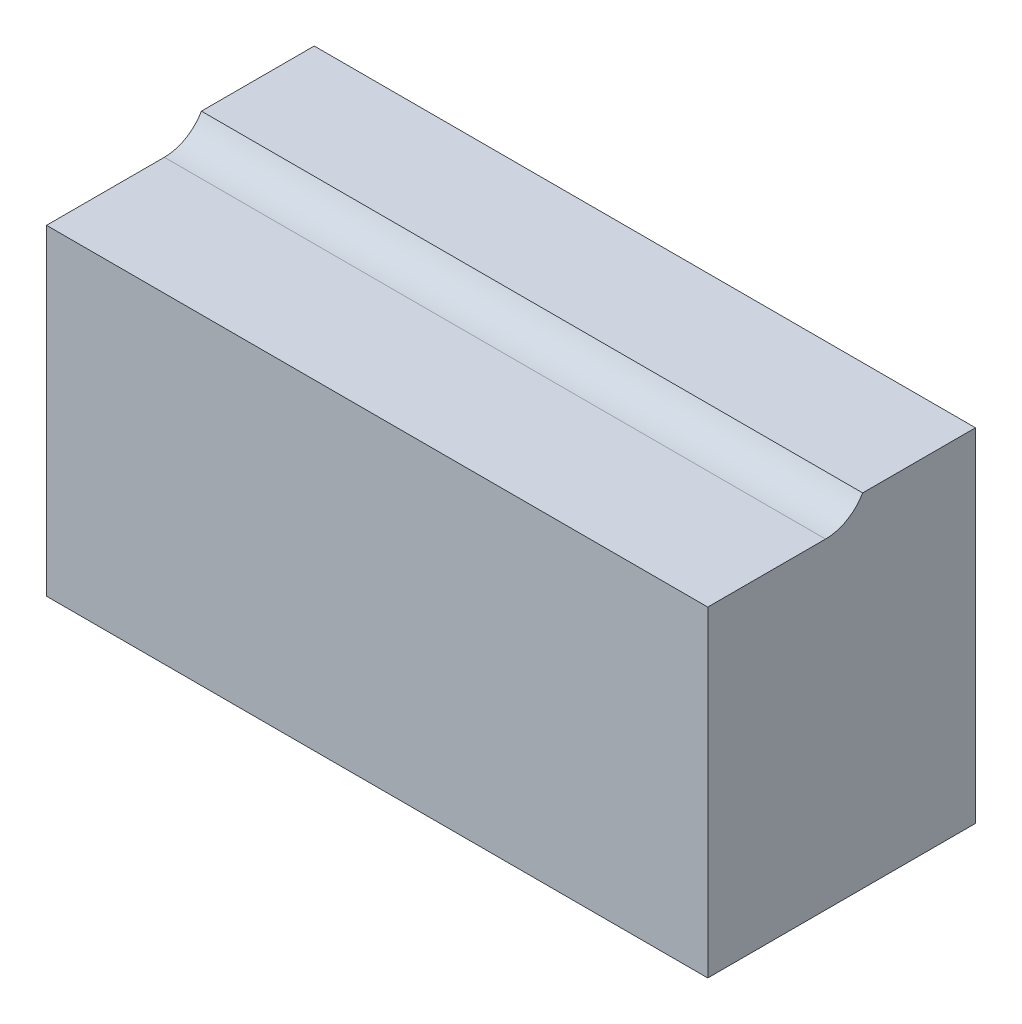
ISO-10303-21;
HEADER;
FILE_DESCRIPTION(('STEP AP214'),'2;1');
FILE_NAME('part.step','',(''),(''),'','','');
FILE_SCHEMA(('AUTOMOTIVE_DESIGN { 1 0 10303 214 1 1 1 1 }'));
ENDSEC;
DATA;
#1=APPLICATION_CONTEXT('core data for automotive mechanical design processes');
#2=APPLICATION_PROTOCOL_DEFINITION('international standard','automotive_design',2000,#1);
#3=PRODUCT_CONTEXT('',#1,'mechanical');
#4=PRODUCT('Part','Part','',(#3));
#5=PRODUCT_RELATED_PRODUCT_CATEGORY('part','',(#4));
#6=PRODUCT_DEFINITION_FORMATION('','',#4);
#7=PRODUCT_DEFINITION_CONTEXT('part definition',#1,'design');
#8=PRODUCT_DEFINITION('design','',#6,#7);
#9=PRODUCT_DEFINITION_SHAPE('','',#8);
#10=(LENGTH_UNIT() NAMED_UNIT(*) SI_UNIT(.MILLI.,.METRE.));
#11=(NAMED_UNIT(*) PLANE_ANGLE_UNIT() SI_UNIT($,.RADIAN.));
#12=(NAMED_UNIT(*) SI_UNIT($,.STERADIAN.) SOLID_ANGLE_UNIT());
#13=UNCERTAINTY_MEASURE_WITH_UNIT(LENGTH_MEASURE(1.E-05),#10,'distance_accuracy_value','');
#14=(GEOMETRIC_REPRESENTATION_CONTEXT(3) GLOBAL_UNCERTAINTY_ASSIGNED_CONTEXT((#13)) GLOBAL_UNIT_ASSIGNED_CONTEXT((#10,
#11,#12)) REPRESENTATION_CONTEXT('',''));
#15=CARTESIAN_POINT('',(0.,0.,0.));
#16=DIRECTION('',(0.,0.,1.));
#17=DIRECTION('',(1.,0.,0.));
#18=AXIS2_PLACEMENT_3D('',#15,#16,#17);
#19=CARTESIAN_POINT('',(5.71543778801842,-38.,12.5));
#20=DIRECTION('',(1.,0.,0.));
#21=DIRECTION('',(0.,1.,0.));
#22=AXIS2_PLACEMENT_3D('',#19,#20,#21);
#23=PLANE('',#22);
#24=DIRECTION('',(0.,-1.,0.));
#25=VECTOR('',#24,1.);
#26=CARTESIAN_POINT('',(5.71543778801842,-38.,12.5));
#27=LINE('',#26,#25);
#28=CARTESIAN_POINT('',(5.71543778801842,-8.,12.5));
#29=VERTEX_POINT('',#28);
#30=CARTESIAN_POINT('',(5.71543778801842,-38.,12.5));
#31=VERTEX_POINT('',#30);
#32=EDGE_CURVE('E103',#29,#31,#27,.T.);
#33=ORIENTED_EDGE('',*,*,#32,.F.);
#34=DIRECTION('',(0.,0.,1.));
#35=VECTOR('',#34,1.);
#36=CARTESIAN_POINT('',(5.71543778801842,-8.,12.5));
#37=LINE('',#36,#35);
#38=CARTESIAN_POINT('',(5.71543778801842,-8.,1.5));
#39=VERTEX_POINT('',#38);
#40=EDGE_CURVE('E129',#39,#29,#37,.T.);
#41=ORIENTED_EDGE('',*,*,#40,.F.);
#42=CARTESIAN_POINT('',(5.71543778801842,-4.,1.5));
#43=DIRECTION('',(1.,0.,0.));
#44=DIRECTION('',(0.,1.,0.));
#45=AXIS2_PLACEMENT_3D('',#42,#43,#44);
#46=CIRCLE('',#45,4.);
#47=CARTESIAN_POINT('',(5.71543778801842,-6.,-1.96410161513775));
#48=VERTEX_POINT('',#47);
#49=EDGE_CURVE('E132',#48,#39,#46,.F.);
#50=ORIENTED_EDGE('',*,*,#49,.F.);
#51=DIRECTION('',(0.,0.,1.));
#52=VECTOR('',#51,1.);
#53=CARTESIAN_POINT('',(5.71543778801842,-6.,-1.96410161513775));
#54=LINE('',#53,#52);
#55=CARTESIAN_POINT('',(5.71543778801842,-6.,-12.5));
#56=VERTEX_POINT('',#55);
#57=EDGE_CURVE('E108',#56,#48,#54,.T.);
#58=ORIENTED_EDGE('',*,*,#57,.F.);
#59=DIRECTION('',(0.,-1.,0.));
#60=VECTOR('',#59,1.);
#61=CARTESIAN_POINT('',(5.71543778801842,-38.,-12.5));
#62=LINE('',#61,#60);
#63=CARTESIAN_POINT('',(5.71543778801842,-38.,-12.5));
#64=VERTEX_POINT('',#63);
#65=EDGE_CURVE('E93',#56,#64,#62,.T.);
#66=ORIENTED_EDGE('',*,*,#65,.T.);
#67=DIRECTION('',(0.,0.,-1.));
#68=VECTOR('',#67,1.);
#69=CARTESIAN_POINT('',(5.71543778801842,-38.,12.5));
#70=LINE('',#69,#68);
#71=EDGE_CURVE('E11',#31,#64,#70,.T.);
#72=ORIENTED_EDGE('',*,*,#71,.F.);
#73=EDGE_LOOP('',(#33,#41,#50,#58,#66,#72));
#74=FACE_BOUND('',#73,.T.);
#75=ADVANCED_FACE('F49',(#74),#23,.F.);
#76=CARTESIAN_POINT('',(5.71543778801842,-38.,12.5));
#77=DIRECTION('',(0.,1.,0.));
#78=DIRECTION('',(0.,0.,1.));
#79=AXIS2_PLACEMENT_3D('',#76,#77,#78);
#80=PLANE('',#79);
#81=CARTESIAN_POINT('',(15.5904377880184,-38.,0.));
#82=DIRECTION('',(0.,-1.,0.));
#83=DIRECTION('',(0.,0.,-1.));
#84=AXIS2_PLACEMENT_3D('',#81,#82,#83);
#85=CIRCLE('',#84,2.49999999999999);
#86=CARTESIAN_POINT('',(15.5904377880184,-38.,-2.49999999999999));
#87=VERTEX_POINT('',#86);
#88=EDGE_CURVE('E144',#87,#87,#85,.T.);
#89=ORIENTED_EDGE('',*,*,#88,.F.);
#90=EDGE_LOOP('',(#89));
#91=FACE_BOUND('',#90,.T.);
#92=CARTESIAN_POINT('',(57.5904377880184,-38.,0.));
#93=DIRECTION('',(0.,-1.,0.));
#94=DIRECTION('',(0.,0.,-1.));
#95=AXIS2_PLACEMENT_3D('',#92,#93,#94);
#96=CIRCLE('',#95,2.49999999999999);
#97=CARTESIAN_POINT('',(57.5904377880184,-38.,-2.49999999999998));
#98=VERTEX_POINT('',#97);
#99=EDGE_CURVE('E138',#98,#98,#96,.T.);
#100=ORIENTED_EDGE('',*,*,#99,.F.);
#101=EDGE_LOOP('',(#100));
#102=FACE_BOUND('',#101,.T.);
#103=DIRECTION('',(1.,0.,0.));
#104=VECTOR('',#103,1.);
#105=CARTESIAN_POINT('',(5.71543778801842,-38.,-12.5));
#106=LINE('',#105,#104);
#107=CARTESIAN_POINT('',(67.4654377880184,-38.,-12.5));
#108=VERTEX_POINT('',#107);
#109=EDGE_CURVE('E84',#64,#108,#106,.T.);
#110=ORIENTED_EDGE('',*,*,#109,.T.);
#111=DIRECTION('',(0.,0.,-1.));
#112=VECTOR('',#111,1.);
#113=CARTESIAN_POINT('',(67.4654377880184,-38.,12.5));
#114=LINE('',#113,#112);
#115=CARTESIAN_POINT('',(67.4654377880184,-38.,12.5));
#116=VERTEX_POINT('',#115);
#117=EDGE_CURVE('E56',#116,#108,#114,.T.);
#118=ORIENTED_EDGE('',*,*,#117,.F.);
#119=DIRECTION('',(1.,0.,0.));
#120=VECTOR('',#119,1.);
#121=CARTESIAN_POINT('',(5.71543778801842,-38.,12.5));
#122=LINE('',#121,#120);
#123=EDGE_CURVE('E72',#31,#116,#122,.T.);
#124=ORIENTED_EDGE('',*,*,#123,.F.);
#125=ORIENTED_EDGE('',*,*,#71,.T.);
#126=EDGE_LOOP('',(#110,#118,#124,#125));
#127=FACE_BOUND('',#126,.T.);
#128=ADVANCED_FACE('F86',(#91,#102,#127),#80,.F.);
#129=CARTESIAN_POINT('',(67.4654377880184,-38.,12.5));
#130=DIRECTION('',(-1.,0.,0.));
#131=DIRECTION('',(0.,0.,1.));
#132=AXIS2_PLACEMENT_3D('',#129,#130,#131);
#133=PLANE('',#132);
#134=CARTESIAN_POINT('',(67.4654377880184,-4.,1.5));
#135=DIRECTION('',(1.,0.,0.));
#136=DIRECTION('',(0.,0.,-1.));
#137=AXIS2_PLACEMENT_3D('',#134,#135,#136);
#138=CIRCLE('',#137,4.);
#139=CARTESIAN_POINT('',(67.4654377880184,-8.,1.5));
#140=VERTEX_POINT('',#139);
#141=CARTESIAN_POINT('',(67.4654377880184,-6.,-1.96410161513775));
#142=VERTEX_POINT('',#141);
#143=EDGE_CURVE('E126',#140,#142,#138,.T.);
#144=ORIENTED_EDGE('',*,*,#143,.F.);
#145=DIRECTION('',(0.,0.,-1.));
#146=VECTOR('',#145,1.);
#147=CARTESIAN_POINT('',(67.4654377880184,-8.,12.5));
#148=LINE('',#147,#146);
#149=CARTESIAN_POINT('',(67.4654377880184,-8.,12.5));
#150=VERTEX_POINT('',#149);
#151=EDGE_CURVE('E116',#150,#140,#148,.T.);
#152=ORIENTED_EDGE('',*,*,#151,.F.);
#153=DIRECTION('',(0.,1.,0.));
#154=VECTOR('',#153,1.);
#155=CARTESIAN_POINT('',(67.4654377880184,-38.,12.5));
#156=LINE('',#155,#154);
#157=EDGE_CURVE('E100',#116,#150,#156,.T.);
#158=ORIENTED_EDGE('',*,*,#157,.F.);
#159=ORIENTED_EDGE('',*,*,#117,.T.);
#160=DIRECTION('',(0.,1.,0.));
#161=VECTOR('',#160,1.);
#162=CARTESIAN_POINT('',(67.4654377880184,-38.,-12.5));
#163=LINE('',#162,#161);
#164=CARTESIAN_POINT('',(67.4654377880184,-6.,-12.5));
#165=VERTEX_POINT('',#164);
#166=EDGE_CURVE('E92',#108,#165,#163,.T.);
#167=ORIENTED_EDGE('',*,*,#166,.T.);
#168=DIRECTION('',(0.,0.,-1.));
#169=VECTOR('',#168,1.);
#170=CARTESIAN_POINT('',(67.4654377880184,-6.,-1.96410161513775));
#171=LINE('',#170,#169);
#172=EDGE_CURVE('E63',#142,#165,#171,.T.);
#173=ORIENTED_EDGE('',*,*,#172,.F.);
#174=EDGE_LOOP('',(#144,#152,#158,#159,#167,#173));
#175=FACE_BOUND('',#174,.T.);
#176=ADVANCED_FACE('F98',(#175),#133,.F.);
#177=CARTESIAN_POINT('',(0.,0.,12.5));
#178=DIRECTION('',(0.,0.,-1.));
#179=DIRECTION('',(-1.,0.,0.));
#180=AXIS2_PLACEMENT_3D('',#177,#178,#179);
#181=PLANE('',#180);
#182=ORIENTED_EDGE('',*,*,#157,.T.);
#183=DIRECTION('',(1.,0.,0.));
#184=VECTOR('',#183,1.);
#185=CARTESIAN_POINT('',(5.71443778801842,-8.,12.5));
#186=LINE('',#185,#184);
#187=EDGE_CURVE('E118',#29,#150,#186,.T.);
#188=ORIENTED_EDGE('',*,*,#187,.F.);
#189=ORIENTED_EDGE('',*,*,#32,.T.);
#190=ORIENTED_EDGE('',*,*,#123,.T.);
#191=EDGE_LOOP('',(#182,#188,#189,#190));
#192=FACE_BOUND('',#191,.T.);
#193=ADVANCED_FACE('F183',(#192),#181,.F.);
#194=CARTESIAN_POINT('',(0.,0.,-12.5));
#195=DIRECTION('',(0.,0.,-1.));
#196=DIRECTION('',(-1.,0.,0.));
#197=AXIS2_PLACEMENT_3D('',#194,#195,#196);
#198=PLANE('',#197);
#199=DIRECTION('',(1.,0.,0.));
#200=VECTOR('',#199,1.);
#201=CARTESIAN_POINT('',(5.71443778801842,-6.,-12.5));
#202=LINE('',#201,#200);
#203=EDGE_CURVE('E102',#56,#165,#202,.T.);
#204=ORIENTED_EDGE('',*,*,#203,.T.);
#205=ORIENTED_EDGE('',*,*,#166,.F.);
#206=ORIENTED_EDGE('',*,*,#109,.F.);
#207=ORIENTED_EDGE('',*,*,#65,.F.);
#208=EDGE_LOOP('',(#204,#205,#206,#207));
#209=FACE_BOUND('',#208,.T.);
#210=ADVANCED_FACE('F101',(#209),#198,.T.);
#211=CARTESIAN_POINT('',(5.71443778801842,-4.,1.5));
#212=DIRECTION('',(1.,0.,0.));
#213=DIRECTION('',(0.,0.,-1.));
#214=AXIS2_PLACEMENT_3D('',#211,#212,#213);
#215=CYLINDRICAL_SURFACE('',#214,4.);
#216=ORIENTED_EDGE('',*,*,#49,.T.);
#217=DIRECTION('',(1.,0.,0.));
#218=VECTOR('',#217,1.);
#219=CARTESIAN_POINT('',(5.71443778801842,-8.,1.5));
#220=LINE('',#219,#218);
#221=EDGE_CURVE('E113',#39,#140,#220,.T.);
#222=ORIENTED_EDGE('',*,*,#221,.T.);
#223=ORIENTED_EDGE('',*,*,#143,.T.);
#224=DIRECTION('',(1.,0.,0.));
#225=VECTOR('',#224,1.);
#226=CARTESIAN_POINT('',(5.71443778801842,-6.,-1.96410161513775));
#227=LINE('',#226,#225);
#228=EDGE_CURVE('E114',#48,#142,#227,.T.);
#229=ORIENTED_EDGE('',*,*,#228,.F.);
#230=EDGE_LOOP('',(#216,#222,#223,#229));
#231=FACE_BOUND('',#230,.T.);
#232=ADVANCED_FACE('F194',(#231),#215,.F.);
#233=CARTESIAN_POINT('',(5.71443778801842,-8.,12.5));
#234=DIRECTION('',(0.,-1.,0.));
#235=DIRECTION('',(0.,0.,-1.));
#236=AXIS2_PLACEMENT_3D('',#233,#234,#235);
#237=PLANE('',#236);
#238=ORIENTED_EDGE('',*,*,#40,.T.);
#239=ORIENTED_EDGE('',*,*,#187,.T.);
#240=ORIENTED_EDGE('',*,*,#151,.T.);
#241=ORIENTED_EDGE('',*,*,#221,.F.);
#242=EDGE_LOOP('',(#238,#239,#240,#241));
#243=FACE_BOUND('',#242,.T.);
#244=ADVANCED_FACE('F186',(#243),#237,.F.);
#245=CARTESIAN_POINT('',(5.71443778801842,-6.,-1.96410161513775));
#246=DIRECTION('',(0.,-1.,0.));
#247=DIRECTION('',(0.,0.,-1.));
#248=AXIS2_PLACEMENT_3D('',#245,#246,#247);
#249=PLANE('',#248);
#250=ORIENTED_EDGE('',*,*,#57,.T.);
#251=ORIENTED_EDGE('',*,*,#228,.T.);
#252=ORIENTED_EDGE('',*,*,#172,.T.);
#253=ORIENTED_EDGE('',*,*,#203,.F.);
#254=EDGE_LOOP('',(#250,#251,#252,#253));
#255=FACE_BOUND('',#254,.T.);
#256=ADVANCED_FACE('F167',(#255),#249,.F.);
#257=CARTESIAN_POINT('',(57.5904377880184,-21.,0.));
#258=DIRECTION('',(0.,-1.,0.));
#259=DIRECTION('',(0.,0.,-1.));
#260=AXIS2_PLACEMENT_3D('',#257,#258,#259);
#261=CONICAL_SURFACE('',#260,2.49999999999999,1.02974425867665);
#262=CARTESIAN_POINT('',(57.5904377880184,-19.4978484524311,0.));
#263=VERTEX_POINT('',#262);
#264=VERTEX_LOOP('',#263);
#265=FACE_BOUND('',#264,.T.);
#266=CARTESIAN_POINT('',(57.5904377880184,-21.,0.));
#267=DIRECTION('',(0.,-1.,0.));
#268=DIRECTION('',(0.,0.,-1.));
#269=AXIS2_PLACEMENT_3D('',#266,#267,#268);
#270=CIRCLE('',#269,2.49999999999999);
#271=CARTESIAN_POINT('',(57.5904377880184,-21.,-2.49999999999998));
#272=VERTEX_POINT('',#271);
#273=EDGE_CURVE('E135',#272,#272,#270,.T.);
#274=ORIENTED_EDGE('',*,*,#273,.T.);
#275=EDGE_LOOP('',(#274));
#276=FACE_BOUND('',#275,.T.);
#277=ADVANCED_FACE('F157',(#265,#276),#261,.F.);
#278=CARTESIAN_POINT('',(57.5904377880184,-38.,0.));
#279=DIRECTION('',(0.,-1.,0.));
#280=DIRECTION('',(0.,0.,-1.));
#281=AXIS2_PLACEMENT_3D('',#278,#279,#280);
#282=CYLINDRICAL_SURFACE('',#281,2.49999999999999);
#283=ORIENTED_EDGE('',*,*,#273,.F.);
#284=EDGE_LOOP('',(#283));
#285=FACE_BOUND('',#284,.T.);
#286=ORIENTED_EDGE('',*,*,#99,.T.);
#287=EDGE_LOOP('',(#286));
#288=FACE_BOUND('',#287,.T.);
#289=ADVANCED_FACE('F154',(#285,#288),#282,.F.);
#290=CARTESIAN_POINT('',(15.5904377880184,-21.,0.));
#291=DIRECTION('',(0.,-1.,0.));
#292=DIRECTION('',(0.,0.,-1.));
#293=AXIS2_PLACEMENT_3D('',#290,#291,#292);
#294=CONICAL_SURFACE('',#293,2.49999999999999,1.02974425867665);
#295=CARTESIAN_POINT('',(15.5904377880184,-19.4978484524311,0.));
#296=VERTEX_POINT('',#295);
#297=VERTEX_LOOP('',#296);
#298=FACE_BOUND('',#297,.T.);
#299=CARTESIAN_POINT('',(15.5904377880184,-21.,0.));
#300=DIRECTION('',(0.,-1.,0.));
#301=DIRECTION('',(0.,0.,-1.));
#302=AXIS2_PLACEMENT_3D('',#299,#300,#301);
#303=CIRCLE('',#302,2.49999999999999);
#304=CARTESIAN_POINT('',(15.5904377880184,-21.,-2.49999999999999));
#305=VERTEX_POINT('',#304);
#306=EDGE_CURVE('E141',#305,#305,#303,.T.);
#307=ORIENTED_EDGE('',*,*,#306,.T.);
#308=EDGE_LOOP('',(#307));
#309=FACE_BOUND('',#308,.T.);
#310=ADVANCED_FACE('F156',(#298,#309),#294,.F.);
#311=CARTESIAN_POINT('',(15.5904377880184,-38.,0.));
#312=DIRECTION('',(0.,-1.,0.));
#313=DIRECTION('',(0.,0.,-1.));
#314=AXIS2_PLACEMENT_3D('',#311,#312,#313);
#315=CYLINDRICAL_SURFACE('',#314,2.49999999999999);
#316=ORIENTED_EDGE('',*,*,#306,.F.);
#317=EDGE_LOOP('',(#316));
#318=FACE_BOUND('',#317,.T.);
#319=ORIENTED_EDGE('',*,*,#88,.T.);
#320=EDGE_LOOP('',(#319));
#321=FACE_BOUND('',#320,.T.);
#322=ADVANCED_FACE('F148',(#318,#321),#315,.F.);
#323=CLOSED_SHELL('',(#75,#128,#176,#193,#210,#232,#244,#256,#277,#289,#310,#322));
#324=MANIFOLD_SOLID_BREP('B2',#323);
#325=ADVANCED_BREP_SHAPE_REPRESENTATION('',(#18,#324),#14);
#326=SHAPE_DEFINITION_REPRESENTATION(#9,#325);
ENDSEC;
END-ISO-10303-21;
